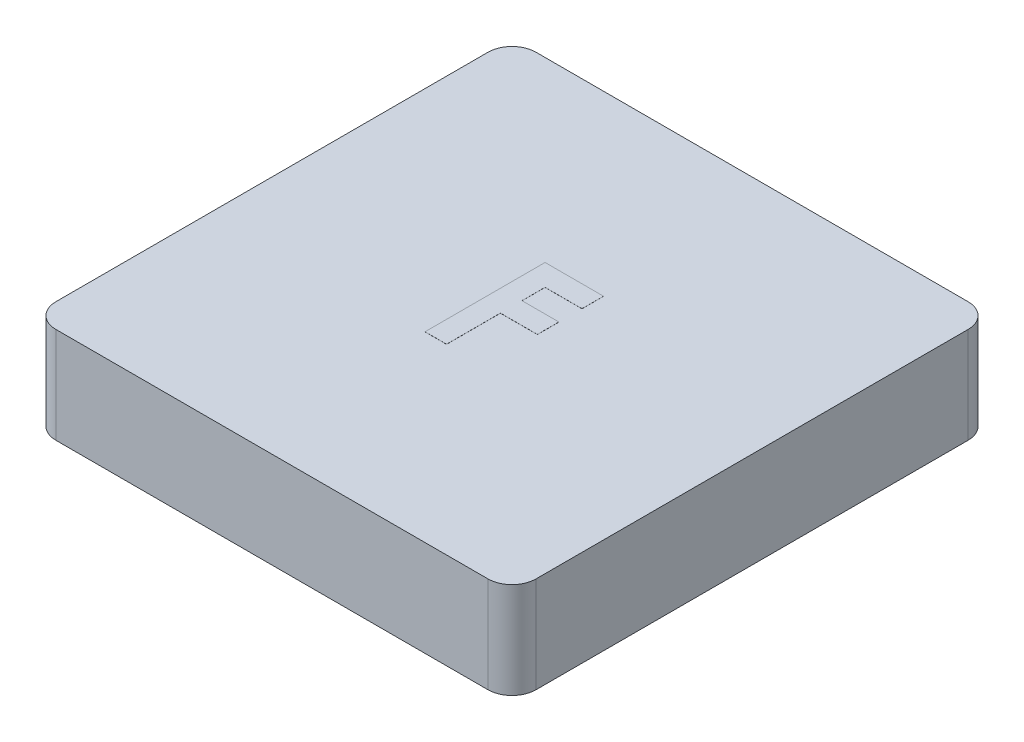
ISO-10303-21;
HEADER;
FILE_DESCRIPTION(('STEP AP214'),'2;1');
FILE_NAME('part.step','',(''),(''),'','','');
FILE_SCHEMA(('AUTOMOTIVE_DESIGN { 1 0 10303 214 1 1 1 1 }'));
ENDSEC;
DATA;
#1=APPLICATION_CONTEXT('core data for automotive mechanical design processes');
#2=APPLICATION_PROTOCOL_DEFINITION('international standard','automotive_design',2000,#1);
#3=PRODUCT_CONTEXT('',#1,'mechanical');
#4=PRODUCT('Part','Part','',(#3));
#5=PRODUCT_RELATED_PRODUCT_CATEGORY('part','',(#4));
#6=PRODUCT_DEFINITION_FORMATION('','',#4);
#7=PRODUCT_DEFINITION_CONTEXT('part definition',#1,'design');
#8=PRODUCT_DEFINITION('design','',#6,#7);
#9=PRODUCT_DEFINITION_SHAPE('','',#8);
#10=(LENGTH_UNIT() NAMED_UNIT(*) SI_UNIT(.MILLI.,.METRE.));
#11=(NAMED_UNIT(*) PLANE_ANGLE_UNIT() SI_UNIT($,.RADIAN.));
#12=(NAMED_UNIT(*) SI_UNIT($,.STERADIAN.) SOLID_ANGLE_UNIT());
#13=UNCERTAINTY_MEASURE_WITH_UNIT(LENGTH_MEASURE(1.E-05),#10,'distance_accuracy_value','');
#14=(GEOMETRIC_REPRESENTATION_CONTEXT(3) GLOBAL_UNCERTAINTY_ASSIGNED_CONTEXT((#13)) GLOBAL_UNIT_ASSIGNED_CONTEXT((#10,
#11,#12)) REPRESENTATION_CONTEXT('',''));
#15=CARTESIAN_POINT('',(0.,0.,0.));
#16=DIRECTION('',(0.,0.,1.));
#17=DIRECTION('',(1.,0.,0.));
#18=AXIS2_PLACEMENT_3D('',#15,#16,#17);
#19=CARTESIAN_POINT('',(0.,2.54,-12.7));
#20=DIRECTION('',(1.,0.,0.));
#21=DIRECTION('',(0.,0.,-1.));
#22=AXIS2_PLACEMENT_3D('',#19,#20,#21);
#23=PLANE('',#22);
#24=DIRECTION('',(0.,0.,1.));
#25=VECTOR('',#24,1.);
#26=CARTESIAN_POINT('',(0.,2.54,-12.7));
#27=LINE('',#26,#25);
#28=CARTESIAN_POINT('',(0.,2.54,-12.065));
#29=VERTEX_POINT('',#28);
#30=CARTESIAN_POINT('',(0.,2.54,-0.635));
#31=VERTEX_POINT('',#30);
#32=EDGE_CURVE('E308',#29,#31,#27,.T.);
#33=ORIENTED_EDGE('',*,*,#32,.F.);
#34=DIRECTION('',(0.,-1.,0.));
#35=VECTOR('',#34,1.);
#36=CARTESIAN_POINT('',(0.,2.54,-12.065));
#37=LINE('',#36,#35);
#38=CARTESIAN_POINT('',(0.,0.,-12.065));
#39=VERTEX_POINT('',#38);
#40=EDGE_CURVE('E333',#29,#39,#37,.T.);
#41=ORIENTED_EDGE('',*,*,#40,.T.);
#42=DIRECTION('',(0.,0.,1.));
#43=VECTOR('',#42,1.);
#44=CARTESIAN_POINT('',(0.,0.,-12.7));
#45=LINE('',#44,#43);
#46=CARTESIAN_POINT('',(0.,0.,-0.635));
#47=VERTEX_POINT('',#46);
#48=EDGE_CURVE('E288',#39,#47,#45,.T.);
#49=ORIENTED_EDGE('',*,*,#48,.T.);
#50=DIRECTION('',(0.,-1.,0.));
#51=VECTOR('',#50,1.);
#52=CARTESIAN_POINT('',(0.,2.54,-0.635));
#53=LINE('',#52,#51);
#54=EDGE_CURVE('E321',#47,#31,#53,.F.);
#55=ORIENTED_EDGE('',*,*,#54,.T.);
#56=EDGE_LOOP('',(#33,#41,#49,#55));
#57=FACE_BOUND('',#56,.T.);
#58=ADVANCED_FACE('F33',(#57),#23,.F.);
#59=CARTESIAN_POINT('',(0.,2.54,0.));
#60=DIRECTION('',(0.,0.,-1.));
#61=DIRECTION('',(-1.,0.,0.));
#62=AXIS2_PLACEMENT_3D('',#59,#60,#61);
#63=PLANE('',#62);
#64=DIRECTION('',(1.,0.,0.));
#65=VECTOR('',#64,1.);
#66=CARTESIAN_POINT('',(0.,0.,0.));
#67=LINE('',#66,#65);
#68=CARTESIAN_POINT('',(0.635,0.,0.));
#69=VERTEX_POINT('',#68);
#70=CARTESIAN_POINT('',(12.065,0.,0.));
#71=VERTEX_POINT('',#70);
#72=EDGE_CURVE('E324',#69,#71,#67,.T.);
#73=ORIENTED_EDGE('',*,*,#72,.T.);
#74=DIRECTION('',(0.,-1.,0.));
#75=VECTOR('',#74,1.);
#76=CARTESIAN_POINT('',(12.065,2.54,0.));
#77=LINE('',#76,#75);
#78=CARTESIAN_POINT('',(12.065,2.54,0.));
#79=VERTEX_POINT('',#78);
#80=EDGE_CURVE('E41',#71,#79,#77,.F.);
#81=ORIENTED_EDGE('',*,*,#80,.T.);
#82=DIRECTION('',(1.,0.,0.));
#83=VECTOR('',#82,1.);
#84=CARTESIAN_POINT('',(0.,2.54,0.));
#85=LINE('',#84,#83);
#86=CARTESIAN_POINT('',(0.635,2.54,0.));
#87=VERTEX_POINT('',#86);
#88=EDGE_CURVE('E311',#87,#79,#85,.T.);
#89=ORIENTED_EDGE('',*,*,#88,.F.);
#90=DIRECTION('',(0.,-1.,0.));
#91=VECTOR('',#90,1.);
#92=CARTESIAN_POINT('',(0.635,2.54,0.));
#93=LINE('',#92,#91);
#94=EDGE_CURVE('E362',#87,#69,#93,.T.);
#95=ORIENTED_EDGE('',*,*,#94,.T.);
#96=EDGE_LOOP('',(#73,#81,#89,#95));
#97=FACE_BOUND('',#96,.T.);
#98=ADVANCED_FACE('F367',(#97),#63,.F.);
#99=CARTESIAN_POINT('',(12.7,2.54,0.));
#100=DIRECTION('',(-1.,0.,0.));
#101=DIRECTION('',(0.,0.,1.));
#102=AXIS2_PLACEMENT_3D('',#99,#100,#101);
#103=PLANE('',#102);
#104=DIRECTION('',(0.,0.,-1.));
#105=VECTOR('',#104,1.);
#106=CARTESIAN_POINT('',(12.7,0.,0.));
#107=LINE('',#106,#105);
#108=CARTESIAN_POINT('',(12.7,0.,-0.635));
#109=VERTEX_POINT('',#108);
#110=CARTESIAN_POINT('',(12.7,0.,-12.065));
#111=VERTEX_POINT('',#110);
#112=EDGE_CURVE('E327',#109,#111,#107,.T.);
#113=ORIENTED_EDGE('',*,*,#112,.T.);
#114=DIRECTION('',(0.,-1.,0.));
#115=VECTOR('',#114,1.);
#116=CARTESIAN_POINT('',(12.7,2.54,-12.065));
#117=LINE('',#116,#115);
#118=CARTESIAN_POINT('',(12.7,2.54,-12.065));
#119=VERTEX_POINT('',#118);
#120=EDGE_CURVE('E360',#111,#119,#117,.F.);
#121=ORIENTED_EDGE('',*,*,#120,.T.);
#122=DIRECTION('',(0.,0.,-1.));
#123=VECTOR('',#122,1.);
#124=CARTESIAN_POINT('',(12.7,2.54,0.));
#125=LINE('',#124,#123);
#126=CARTESIAN_POINT('',(12.7,2.54,-0.635));
#127=VERTEX_POINT('',#126);
#128=EDGE_CURVE('E315',#127,#119,#125,.T.);
#129=ORIENTED_EDGE('',*,*,#128,.F.);
#130=DIRECTION('',(0.,-1.,0.));
#131=VECTOR('',#130,1.);
#132=CARTESIAN_POINT('',(12.7,2.54,-0.635));
#133=LINE('',#132,#131);
#134=EDGE_CURVE('E357',#127,#109,#133,.T.);
#135=ORIENTED_EDGE('',*,*,#134,.T.);
#136=EDGE_LOOP('',(#113,#121,#129,#135));
#137=FACE_BOUND('',#136,.T.);
#138=ADVANCED_FACE('F380',(#137),#103,.F.);
#139=CARTESIAN_POINT('',(12.7,2.54,-12.7));
#140=DIRECTION('',(0.,0.,1.));
#141=DIRECTION('',(1.,0.,0.));
#142=AXIS2_PLACEMENT_3D('',#139,#140,#141);
#143=PLANE('',#142);
#144=DIRECTION('',(-1.,0.,0.));
#145=VECTOR('',#144,1.);
#146=CARTESIAN_POINT('',(12.7,0.,-12.7));
#147=LINE('',#146,#145);
#148=CARTESIAN_POINT('',(12.065,0.,-12.7));
#149=VERTEX_POINT('',#148);
#150=CARTESIAN_POINT('',(0.634999999999995,0.,-12.7));
#151=VERTEX_POINT('',#150);
#152=EDGE_CURVE('E312',#149,#151,#147,.T.);
#153=ORIENTED_EDGE('',*,*,#152,.T.);
#154=DIRECTION('',(0.,-1.,0.));
#155=VECTOR('',#154,1.);
#156=CARTESIAN_POINT('',(0.634999999999995,2.54,-12.7));
#157=LINE('',#156,#155);
#158=CARTESIAN_POINT('',(0.634999999999995,2.54,-12.7));
#159=VERTEX_POINT('',#158);
#160=EDGE_CURVE('E347',#151,#159,#157,.F.);
#161=ORIENTED_EDGE('',*,*,#160,.T.);
#162=DIRECTION('',(-1.,0.,0.));
#163=VECTOR('',#162,1.);
#164=CARTESIAN_POINT('',(12.7,2.54,-12.7));
#165=LINE('',#164,#163);
#166=CARTESIAN_POINT('',(12.065,2.54,-12.7));
#167=VERTEX_POINT('',#166);
#168=EDGE_CURVE('E318',#167,#159,#165,.T.);
#169=ORIENTED_EDGE('',*,*,#168,.F.);
#170=DIRECTION('',(0.,-1.,0.));
#171=VECTOR('',#170,1.);
#172=CARTESIAN_POINT('',(12.065,2.54,-12.7));
#173=LINE('',#172,#171);
#174=EDGE_CURVE('E344',#167,#149,#173,.T.);
#175=ORIENTED_EDGE('',*,*,#174,.T.);
#176=EDGE_LOOP('',(#153,#161,#169,#175));
#177=FACE_BOUND('',#176,.T.);
#178=ADVANCED_FACE('F392',(#177),#143,.F.);
#179=CARTESIAN_POINT('',(0.,2.54,0.));
#180=DIRECTION('',(0.,1.,0.));
#181=DIRECTION('',(0.,0.,1.));
#182=AXIS2_PLACEMENT_3D('',#179,#180,#181);
#183=PLANE('',#182);
#184=DIRECTION('',(0.,0.,-1.));
#185=VECTOR('',#184,1.);
#186=CARTESIAN_POINT('',(5.57334615384615,2.54,-4.826));
#187=LINE('',#186,#185);
#188=CARTESIAN_POINT('',(5.57334615384615,2.54,-4.826));
#189=VERTEX_POINT('',#188);
#190=CARTESIAN_POINT('',(5.57334615384615,2.54,-8.001));
#191=VERTEX_POINT('',#190);
#192=EDGE_CURVE('E230',#189,#191,#187,.T.);
#193=ORIENTED_EDGE('',*,*,#192,.T.);
#194=DIRECTION('',(1.,0.,0.));
#195=VECTOR('',#194,1.);
#196=CARTESIAN_POINT('',(5.57334615384615,2.54,-8.001));
#197=LINE('',#196,#195);
#198=CARTESIAN_POINT('',(7.12014102564102,2.54,-8.001));
#199=VERTEX_POINT('',#198);
#200=EDGE_CURVE('E187',#191,#199,#197,.T.);
#201=ORIENTED_EDGE('',*,*,#200,.T.);
#202=DIRECTION('',(0.,0.,1.));
#203=VECTOR('',#202,1.);
#204=CARTESIAN_POINT('',(7.12014102564102,2.54,-8.001));
#205=LINE('',#204,#203);
#206=CARTESIAN_POINT('',(7.12014102564102,2.54,-7.4311282051282));
#207=VERTEX_POINT('',#206);
#208=EDGE_CURVE('E233',#199,#207,#205,.T.);
#209=ORIENTED_EDGE('',*,*,#208,.T.);
#210=DIRECTION('',(-1.,0.,0.));
#211=VECTOR('',#210,1.);
#212=CARTESIAN_POINT('',(7.12014102564102,2.54,-7.4311282051282));
#213=LINE('',#212,#211);
#214=CARTESIAN_POINT('',(6.14321794871794,2.54,-7.4311282051282));
#215=VERTEX_POINT('',#214);
#216=EDGE_CURVE('E235',#207,#215,#213,.T.);
#217=ORIENTED_EDGE('',*,*,#216,.T.);
#218=DIRECTION('',(0.,0.,1.));
#219=VECTOR('',#218,1.);
#220=CARTESIAN_POINT('',(6.14321794871794,2.54,-7.4311282051282));
#221=LINE('',#220,#219);
#222=CARTESIAN_POINT('',(6.14321794871794,2.54,-6.82055128205128));
#223=VERTEX_POINT('',#222);
#224=EDGE_CURVE('E237',#215,#223,#221,.T.);
#225=ORIENTED_EDGE('',*,*,#224,.T.);
#226=DIRECTION('',(1.,0.,0.));
#227=VECTOR('',#226,1.);
#228=CARTESIAN_POINT('',(6.14321794871794,2.54,-6.82055128205128));
#229=LINE('',#228,#227);
#230=CARTESIAN_POINT('',(7.12014102564102,2.54,-6.82055128205128));
#231=VERTEX_POINT('',#230);
#232=EDGE_CURVE('E239',#223,#231,#229,.T.);
#233=ORIENTED_EDGE('',*,*,#232,.T.);
#234=DIRECTION('',(0.,0.,1.));
#235=VECTOR('',#234,1.);
#236=CARTESIAN_POINT('',(7.12014102564102,2.54,-6.82055128205128));
#237=LINE('',#236,#235);
#238=CARTESIAN_POINT('',(7.12014102564102,2.54,-6.25067948717949));
#239=VERTEX_POINT('',#238);
#240=EDGE_CURVE('E241',#231,#239,#237,.T.);
#241=ORIENTED_EDGE('',*,*,#240,.T.);
#242=DIRECTION('',(-1.,0.,0.));
#243=VECTOR('',#242,1.);
#244=CARTESIAN_POINT('',(7.12014102564102,2.54,-6.25067948717949));
#245=LINE('',#244,#243);
#246=CARTESIAN_POINT('',(6.14321794871794,2.54,-6.25067948717949));
#247=VERTEX_POINT('',#246);
#248=EDGE_CURVE('E243',#239,#247,#245,.T.);
#249=ORIENTED_EDGE('',*,*,#248,.T.);
#250=DIRECTION('',(0.,0.,1.));
#251=VECTOR('',#250,1.);
#252=CARTESIAN_POINT('',(6.14321794871794,2.54,-6.25067948717949));
#253=LINE('',#252,#251);
#254=CARTESIAN_POINT('',(6.14321794871794,2.54,-4.826));
#255=VERTEX_POINT('',#254);
#256=EDGE_CURVE('E53',#247,#255,#253,.T.);
#257=ORIENTED_EDGE('',*,*,#256,.T.);
#258=DIRECTION('',(-1.,0.,0.));
#259=VECTOR('',#258,1.);
#260=CARTESIAN_POINT('',(6.14321794871794,2.54,-4.826));
#261=LINE('',#260,#259);
#262=EDGE_CURVE('E48',#255,#189,#261,.T.);
#263=ORIENTED_EDGE('',*,*,#262,.T.);
#264=EDGE_LOOP('',(#193,#201,#209,#217,#225,#233,#241,#249,#257,#263));
#265=FACE_BOUND('',#264,.T.);
#266=ORIENTED_EDGE('',*,*,#168,.T.);
#267=CARTESIAN_POINT('',(0.634999999999995,2.54,-12.065));
#268=DIRECTION('',(0.,1.,0.));
#269=DIRECTION('',(0.,0.,1.));
#270=AXIS2_PLACEMENT_3D('',#267,#268,#269);
#271=CIRCLE('',#270,0.635);
#272=EDGE_CURVE('E355',#159,#29,#271,.T.);
#273=ORIENTED_EDGE('',*,*,#272,.T.);
#274=ORIENTED_EDGE('',*,*,#32,.T.);
#275=CARTESIAN_POINT('',(0.635,2.54,-0.635));
#276=DIRECTION('',(0.,1.,0.));
#277=DIRECTION('',(0.,0.,1.));
#278=AXIS2_PLACEMENT_3D('',#275,#276,#277);
#279=CIRCLE('',#278,0.635);
#280=EDGE_CURVE('E349',#31,#87,#279,.T.);
#281=ORIENTED_EDGE('',*,*,#280,.T.);
#282=ORIENTED_EDGE('',*,*,#88,.T.);
#283=CARTESIAN_POINT('',(12.065,2.54,-0.635));
#284=DIRECTION('',(0.,1.,0.));
#285=DIRECTION('',(0.,0.,1.));
#286=AXIS2_PLACEMENT_3D('',#283,#284,#285);
#287=CIRCLE('',#286,0.635);
#288=EDGE_CURVE('E351',#79,#127,#287,.T.);
#289=ORIENTED_EDGE('',*,*,#288,.T.);
#290=ORIENTED_EDGE('',*,*,#128,.T.);
#291=CARTESIAN_POINT('',(12.065,2.54,-12.065));
#292=DIRECTION('',(0.,1.,0.));
#293=DIRECTION('',(0.,0.,1.));
#294=AXIS2_PLACEMENT_3D('',#291,#292,#293);
#295=CIRCLE('',#294,0.635);
#296=EDGE_CURVE('E353',#119,#167,#295,.T.);
#297=ORIENTED_EDGE('',*,*,#296,.T.);
#298=EDGE_LOOP('',(#266,#273,#274,#281,#282,#289,#290,#297));
#299=FACE_BOUND('',#298,.T.);
#300=ADVANCED_FACE('F373',(#265,#299),#183,.T.);
#301=CARTESIAN_POINT('',(0.,0.,0.));
#302=DIRECTION('',(0.,1.,0.));
#303=DIRECTION('',(0.,0.,1.));
#304=AXIS2_PLACEMENT_3D('',#301,#302,#303);
#305=PLANE('',#304);
#306=DIRECTION('',(-1.,0.,0.));
#307=VECTOR('',#306,1.);
#308=CARTESIAN_POINT('',(12.7,0.,-12.065));
#309=LINE('',#308,#307);
#310=CARTESIAN_POINT('',(12.065,0.,-12.065));
#311=VERTEX_POINT('',#310);
#312=CARTESIAN_POINT('',(0.634999999999995,0.,-12.065));
#313=VERTEX_POINT('',#312);
#314=EDGE_CURVE('E276',#311,#313,#309,.T.);
#315=ORIENTED_EDGE('',*,*,#314,.T.);
#316=DIRECTION('',(0.,0.,1.));
#317=VECTOR('',#316,1.);
#318=CARTESIAN_POINT('',(0.634999999999995,0.,-12.7));
#319=LINE('',#318,#317);
#320=CARTESIAN_POINT('',(0.635,0.,-0.635));
#321=VERTEX_POINT('',#320);
#322=EDGE_CURVE('E271',#313,#321,#319,.T.);
#323=ORIENTED_EDGE('',*,*,#322,.T.);
#324=DIRECTION('',(1.,0.,0.));
#325=VECTOR('',#324,1.);
#326=CARTESIAN_POINT('',(0.,0.,-0.635));
#327=LINE('',#326,#325);
#328=CARTESIAN_POINT('',(12.065,0.,-0.635));
#329=VERTEX_POINT('',#328);
#330=EDGE_CURVE('E300',#321,#329,#327,.T.);
#331=ORIENTED_EDGE('',*,*,#330,.T.);
#332=DIRECTION('',(0.,0.,-1.));
#333=VECTOR('',#332,1.);
#334=CARTESIAN_POINT('',(12.065,0.,0.));
#335=LINE('',#334,#333);
#336=EDGE_CURVE('E303',#329,#311,#335,.T.);
#337=ORIENTED_EDGE('',*,*,#336,.T.);
#338=EDGE_LOOP('',(#315,#323,#331,#337));
#339=FACE_BOUND('',#338,.T.);
#340=ORIENTED_EDGE('',*,*,#48,.F.);
#341=CARTESIAN_POINT('',(0.634999999999995,0.,-12.065));
#342=DIRECTION('',(0.,1.,0.));
#343=DIRECTION('',(0.,0.,1.));
#344=AXIS2_PLACEMENT_3D('',#341,#342,#343);
#345=CIRCLE('',#344,0.635);
#346=EDGE_CURVE('E342',#39,#151,#345,.F.);
#347=ORIENTED_EDGE('',*,*,#346,.T.);
#348=ORIENTED_EDGE('',*,*,#152,.F.);
#349=CARTESIAN_POINT('',(12.065,0.,-12.065));
#350=DIRECTION('',(0.,1.,0.));
#351=DIRECTION('',(0.,0.,1.));
#352=AXIS2_PLACEMENT_3D('',#349,#350,#351);
#353=CIRCLE('',#352,0.635);
#354=EDGE_CURVE('E340',#149,#111,#353,.F.);
#355=ORIENTED_EDGE('',*,*,#354,.T.);
#356=ORIENTED_EDGE('',*,*,#112,.F.);
#357=CARTESIAN_POINT('',(12.065,0.,-0.635));
#358=DIRECTION('',(0.,1.,0.));
#359=DIRECTION('',(0.,0.,1.));
#360=AXIS2_PLACEMENT_3D('',#357,#358,#359);
#361=CIRCLE('',#360,0.635);
#362=EDGE_CURVE('E338',#109,#71,#361,.F.);
#363=ORIENTED_EDGE('',*,*,#362,.T.);
#364=ORIENTED_EDGE('',*,*,#72,.F.);
#365=CARTESIAN_POINT('',(0.635,0.,-0.635));
#366=DIRECTION('',(0.,1.,0.));
#367=DIRECTION('',(0.,0.,1.));
#368=AXIS2_PLACEMENT_3D('',#365,#366,#367);
#369=CIRCLE('',#368,0.635);
#370=EDGE_CURVE('E336',#69,#47,#369,.F.);
#371=ORIENTED_EDGE('',*,*,#370,.T.);
#372=EDGE_LOOP('',(#340,#347,#348,#355,#356,#363,#364,#371));
#373=FACE_BOUND('',#372,.T.);
#374=ADVANCED_FACE('F384',(#339,#373),#305,.F.);
#375=CARTESIAN_POINT('',(0.634999999999995,2.54,-12.065));
#376=DIRECTION('',(0.,-1.,0.));
#377=DIRECTION('',(0.,0.,-1.));
#378=AXIS2_PLACEMENT_3D('',#375,#376,#377);
#379=CYLINDRICAL_SURFACE('',#378,0.635);
#380=ORIENTED_EDGE('',*,*,#272,.F.);
#381=ORIENTED_EDGE('',*,*,#160,.F.);
#382=ORIENTED_EDGE('',*,*,#346,.F.);
#383=ORIENTED_EDGE('',*,*,#40,.F.);
#384=EDGE_LOOP('',(#380,#381,#382,#383));
#385=FACE_BOUND('',#384,.T.);
#386=ADVANCED_FACE('F398',(#385),#379,.T.);
#387=CARTESIAN_POINT('',(12.065,2.54,-12.065));
#388=DIRECTION('',(0.,-1.,0.));
#389=DIRECTION('',(0.,0.,-1.));
#390=AXIS2_PLACEMENT_3D('',#387,#388,#389);
#391=CYLINDRICAL_SURFACE('',#390,0.635);
#392=ORIENTED_EDGE('',*,*,#296,.F.);
#393=ORIENTED_EDGE('',*,*,#120,.F.);
#394=ORIENTED_EDGE('',*,*,#354,.F.);
#395=ORIENTED_EDGE('',*,*,#174,.F.);
#396=EDGE_LOOP('',(#392,#393,#394,#395));
#397=FACE_BOUND('',#396,.T.);
#398=ADVANCED_FACE('F389',(#397),#391,.T.);
#399=CARTESIAN_POINT('',(12.065,2.54,-0.635));
#400=DIRECTION('',(0.,-1.,0.));
#401=DIRECTION('',(0.,0.,-1.));
#402=AXIS2_PLACEMENT_3D('',#399,#400,#401);
#403=CYLINDRICAL_SURFACE('',#402,0.635);
#404=ORIENTED_EDGE('',*,*,#288,.F.);
#405=ORIENTED_EDGE('',*,*,#80,.F.);
#406=ORIENTED_EDGE('',*,*,#362,.F.);
#407=ORIENTED_EDGE('',*,*,#134,.F.);
#408=EDGE_LOOP('',(#404,#405,#406,#407));
#409=FACE_BOUND('',#408,.T.);
#410=ADVANCED_FACE('F377',(#409),#403,.T.);
#411=CARTESIAN_POINT('',(0.635,2.54,-0.635));
#412=DIRECTION('',(0.,-1.,0.));
#413=DIRECTION('',(0.,0.,-1.));
#414=AXIS2_PLACEMENT_3D('',#411,#412,#413);
#415=CYLINDRICAL_SURFACE('',#414,0.635);
#416=ORIENTED_EDGE('',*,*,#280,.F.);
#417=ORIENTED_EDGE('',*,*,#54,.F.);
#418=ORIENTED_EDGE('',*,*,#370,.F.);
#419=ORIENTED_EDGE('',*,*,#94,.F.);
#420=EDGE_LOOP('',(#416,#417,#418,#419));
#421=FACE_BOUND('',#420,.T.);
#422=ADVANCED_FACE('F35',(#421),#415,.T.);
#423=CARTESIAN_POINT('',(0.634999999999995,2.54,-12.7));
#424=DIRECTION('',(1.,0.,0.));
#425=DIRECTION('',(0.,0.,-1.));
#426=AXIS2_PLACEMENT_3D('',#423,#424,#425);
#427=PLANE('',#426);
#428=DIRECTION('',(0.,0.,1.));
#429=VECTOR('',#428,1.);
#430=CARTESIAN_POINT('',(0.634999999999995,1.905,-12.7));
#431=LINE('',#430,#429);
#432=CARTESIAN_POINT('',(0.634999999999995,1.905,-12.065));
#433=VERTEX_POINT('',#432);
#434=CARTESIAN_POINT('',(0.635,1.905,-0.635));
#435=VERTEX_POINT('',#434);
#436=EDGE_CURVE('E272',#433,#435,#431,.T.);
#437=ORIENTED_EDGE('',*,*,#436,.T.);
#438=DIRECTION('',(0.,1.,0.));
#439=VECTOR('',#438,1.);
#440=CARTESIAN_POINT('',(0.635,2.54,-0.635));
#441=LINE('',#440,#439);
#442=EDGE_CURVE('E281',#321,#435,#441,.T.);
#443=ORIENTED_EDGE('',*,*,#442,.F.);
#444=ORIENTED_EDGE('',*,*,#322,.F.);
#445=DIRECTION('',(0.,1.,0.));
#446=VECTOR('',#445,1.);
#447=CARTESIAN_POINT('',(0.634999999999995,2.54,-12.065));
#448=LINE('',#447,#446);
#449=EDGE_CURVE('E277',#313,#433,#448,.T.);
#450=ORIENTED_EDGE('',*,*,#449,.T.);
#451=EDGE_LOOP('',(#437,#443,#444,#450));
#452=FACE_BOUND('',#451,.T.);
#453=ADVANCED_FACE('F403',(#452),#427,.T.);
#454=CARTESIAN_POINT('',(0.,2.54,-0.635));
#455=DIRECTION('',(0.,0.,-1.));
#456=DIRECTION('',(-1.,0.,0.));
#457=AXIS2_PLACEMENT_3D('',#454,#455,#456);
#458=PLANE('',#457);
#459=ORIENTED_EDGE('',*,*,#330,.F.);
#460=ORIENTED_EDGE('',*,*,#442,.T.);
#461=DIRECTION('',(1.,0.,0.));
#462=VECTOR('',#461,1.);
#463=CARTESIAN_POINT('',(0.,1.905,-0.635));
#464=LINE('',#463,#462);
#465=CARTESIAN_POINT('',(12.065,1.905,-0.635));
#466=VERTEX_POINT('',#465);
#467=EDGE_CURVE('E275',#435,#466,#464,.T.);
#468=ORIENTED_EDGE('',*,*,#467,.T.);
#469=DIRECTION('',(0.,1.,0.));
#470=VECTOR('',#469,1.);
#471=CARTESIAN_POINT('',(12.065,2.54,-0.635));
#472=LINE('',#471,#470);
#473=EDGE_CURVE('E285',#329,#466,#472,.T.);
#474=ORIENTED_EDGE('',*,*,#473,.F.);
#475=EDGE_LOOP('',(#459,#460,#468,#474));
#476=FACE_BOUND('',#475,.T.);
#477=ADVANCED_FACE('F408',(#476),#458,.T.);
#478=CARTESIAN_POINT('',(12.065,2.54,0.));
#479=DIRECTION('',(-1.,0.,0.));
#480=DIRECTION('',(0.,0.,1.));
#481=AXIS2_PLACEMENT_3D('',#478,#479,#480);
#482=PLANE('',#481);
#483=ORIENTED_EDGE('',*,*,#336,.F.);
#484=ORIENTED_EDGE('',*,*,#473,.T.);
#485=DIRECTION('',(0.,0.,-1.));
#486=VECTOR('',#485,1.);
#487=CARTESIAN_POINT('',(12.065,1.905,0.));
#488=LINE('',#487,#486);
#489=CARTESIAN_POINT('',(12.065,1.905,-12.065));
#490=VERTEX_POINT('',#489);
#491=EDGE_CURVE('E291',#466,#490,#488,.T.);
#492=ORIENTED_EDGE('',*,*,#491,.T.);
#493=DIRECTION('',(0.,1.,0.));
#494=VECTOR('',#493,1.);
#495=CARTESIAN_POINT('',(12.065,2.54,-12.065));
#496=LINE('',#495,#494);
#497=EDGE_CURVE('E280',#311,#490,#496,.T.);
#498=ORIENTED_EDGE('',*,*,#497,.F.);
#499=EDGE_LOOP('',(#483,#484,#492,#498));
#500=FACE_BOUND('',#499,.T.);
#501=ADVANCED_FACE('F461',(#500),#482,.T.);
#502=CARTESIAN_POINT('',(12.7,2.54,-12.065));
#503=DIRECTION('',(0.,0.,1.));
#504=DIRECTION('',(1.,0.,0.));
#505=AXIS2_PLACEMENT_3D('',#502,#503,#504);
#506=PLANE('',#505);
#507=ORIENTED_EDGE('',*,*,#314,.F.);
#508=ORIENTED_EDGE('',*,*,#497,.T.);
#509=DIRECTION('',(-1.,0.,0.));
#510=VECTOR('',#509,1.);
#511=CARTESIAN_POINT('',(12.7,1.905,-12.065));
#512=LINE('',#511,#510);
#513=EDGE_CURVE('E284',#490,#433,#512,.T.);
#514=ORIENTED_EDGE('',*,*,#513,.T.);
#515=ORIENTED_EDGE('',*,*,#449,.F.);
#516=EDGE_LOOP('',(#507,#508,#514,#515));
#517=FACE_BOUND('',#516,.T.);
#518=ADVANCED_FACE('F471',(#517),#506,.T.);
#519=CARTESIAN_POINT('',(0.,1.905,0.));
#520=DIRECTION('',(0.,1.,0.));
#521=DIRECTION('',(0.,0.,1.));
#522=AXIS2_PLACEMENT_3D('',#519,#520,#521);
#523=PLANE('',#522);
#524=CARTESIAN_POINT('',(6.34999999999999,1.905,-6.35));
#525=DIRECTION('',(0.,1.,0.));
#526=DIRECTION('',(0.,0.,1.));
#527=AXIS2_PLACEMENT_3D('',#524,#525,#526);
#528=CIRCLE('',#527,2.54);
#529=CARTESIAN_POINT('',(6.34999999999999,1.905,-3.81));
#530=VERTEX_POINT('',#529);
#531=EDGE_CURVE('E11',#530,#530,#528,.F.);
#532=ORIENTED_EDGE('',*,*,#531,.F.);
#533=EDGE_LOOP('',(#532));
#534=FACE_BOUND('',#533,.T.);
#535=ORIENTED_EDGE('',*,*,#513,.F.);
#536=ORIENTED_EDGE('',*,*,#491,.F.);
#537=ORIENTED_EDGE('',*,*,#467,.F.);
#538=ORIENTED_EDGE('',*,*,#436,.F.);
#539=EDGE_LOOP('',(#535,#536,#537,#538));
#540=FACE_BOUND('',#539,.T.);
#541=ADVANCED_FACE('F481',(#534,#540),#523,.F.);
#542=CARTESIAN_POINT('',(6.34999999999999,-7.18420489685532,-6.35));
#543=DIRECTION('',(0.,1.,0.));
#544=DIRECTION('',(0.,0.,1.));
#545=AXIS2_PLACEMENT_3D('',#542,#543,#544);
#546=CYLINDRICAL_SURFACE('',#545,2.54);
#547=CARTESIAN_POINT('',(6.34999999999999,0.,-6.35));
#548=DIRECTION('',(0.,1.,0.));
#549=DIRECTION('',(0.,0.,1.));
#550=AXIS2_PLACEMENT_3D('',#547,#548,#549);
#551=CIRCLE('',#550,2.54);
#552=CARTESIAN_POINT('',(6.34999999999999,0.,-3.81));
#553=VERTEX_POINT('',#552);
#554=EDGE_CURVE('E247',#553,#553,#551,.T.);
#555=CARTESIAN_POINT('',(6.34999999999999,0.,-3.81));
#556=CARTESIAN_POINT('',(6.34999999999999,0.0198437499999991,-3.81));
#557=CARTESIAN_POINT('',(6.34999999999999,0.0396874999999989,-3.81));
#558=CARTESIAN_POINT('',(6.34999999999999,0.079374999999999,-3.81));
#559=CARTESIAN_POINT('',(6.34999999999999,0.0992187499999992,-3.81));
#560=CARTESIAN_POINT('',(6.34999999999999,0.138906249999999,-3.81));
#561=CARTESIAN_POINT('',(6.34999999999999,0.158749999999999,-3.81));
#562=CARTESIAN_POINT('',(6.34999999999999,0.198437499999999,-3.81));
#563=CARTESIAN_POINT('',(6.34999999999999,0.218281249999999,-3.81));
#564=CARTESIAN_POINT('',(6.34999999999999,0.25796875,-3.81));
#565=CARTESIAN_POINT('',(6.34999999999999,0.277812499999999,-3.81));
#566=CARTESIAN_POINT('',(6.34999999999999,0.317499999999999,-3.81));
#567=CARTESIAN_POINT('',(6.34999999999999,0.337343749999999,-3.81));
#568=CARTESIAN_POINT('',(6.34999999999999,0.377031249999999,-3.81));
#569=CARTESIAN_POINT('',(6.34999999999999,0.396874999999999,-3.81));
#570=CARTESIAN_POINT('',(6.34999999999999,0.436562499999999,-3.81));
#571=CARTESIAN_POINT('',(6.34999999999999,0.456406249999999,-3.81));
#572=CARTESIAN_POINT('',(6.34999999999999,0.496093749999999,-3.81));
#573=CARTESIAN_POINT('',(6.34999999999999,0.515937499999999,-3.81));
#574=CARTESIAN_POINT('',(6.34999999999999,0.555624999999999,-3.81));
#575=CARTESIAN_POINT('',(6.34999999999999,0.575468749999999,-3.81));
#576=CARTESIAN_POINT('',(6.34999999999999,0.615156249999999,-3.81));
#577=CARTESIAN_POINT('',(6.34999999999999,0.634999999999999,-3.81));
#578=CARTESIAN_POINT('',(6.34999999999999,0.674687499999998,-3.81));
#579=CARTESIAN_POINT('',(6.34999999999999,0.694531249999998,-3.81));
#580=CARTESIAN_POINT('',(6.34999999999999,0.734218749999998,-3.81));
#581=CARTESIAN_POINT('',(6.34999999999999,0.754062499999998,-3.81));
#582=CARTESIAN_POINT('',(6.34999999999999,0.793749999999998,-3.81));
#583=CARTESIAN_POINT('',(6.34999999999999,0.813593749999999,-3.81));
#584=CARTESIAN_POINT('',(6.34999999999999,0.853281249999999,-3.81));
#585=CARTESIAN_POINT('',(6.34999999999999,0.873124999999999,-3.81));
#586=CARTESIAN_POINT('',(6.34999999999999,0.912812499999999,-3.81));
#587=CARTESIAN_POINT('',(6.34999999999999,0.932656249999999,-3.81));
#588=CARTESIAN_POINT('',(6.34999999999999,0.972343749999998,-3.81));
#589=CARTESIAN_POINT('',(6.34999999999999,0.992187499999998,-3.81));
#590=CARTESIAN_POINT('',(6.34999999999999,1.031875,-3.81));
#591=CARTESIAN_POINT('',(6.34999999999999,1.05171875,-3.81));
#592=CARTESIAN_POINT('',(6.34999999999999,1.09140625,-3.81));
#593=CARTESIAN_POINT('',(6.34999999999999,1.11125,-3.81));
#594=CARTESIAN_POINT('',(6.34999999999999,1.1509375,-3.81));
#595=CARTESIAN_POINT('',(6.34999999999999,1.17078125,-3.81));
#596=CARTESIAN_POINT('',(6.34999999999999,1.21046875,-3.81));
#597=CARTESIAN_POINT('',(6.34999999999999,1.2303125,-3.81));
#598=CARTESIAN_POINT('',(6.34999999999999,1.27,-3.81));
#599=CARTESIAN_POINT('',(6.34999999999999,1.28984375,-3.81));
#600=CARTESIAN_POINT('',(6.34999999999999,1.32953125,-3.81));
#601=CARTESIAN_POINT('',(6.34999999999999,1.349375,-3.81));
#602=CARTESIAN_POINT('',(6.34999999999999,1.3890625,-3.81));
#603=CARTESIAN_POINT('',(6.34999999999999,1.40890625,-3.81));
#604=CARTESIAN_POINT('',(6.34999999999999,1.44859375,-3.81));
#605=CARTESIAN_POINT('',(6.34999999999999,1.4684375,-3.81));
#606=CARTESIAN_POINT('',(6.34999999999999,1.508125,-3.81));
#607=CARTESIAN_POINT('',(6.34999999999999,1.52796875,-3.81));
#608=CARTESIAN_POINT('',(6.34999999999999,1.56765625,-3.81));
#609=CARTESIAN_POINT('',(6.34999999999999,1.5875,-3.81));
#610=CARTESIAN_POINT('',(6.34999999999999,1.6271875,-3.81));
#611=CARTESIAN_POINT('',(6.34999999999999,1.64703125,-3.81));
#612=CARTESIAN_POINT('',(6.34999999999999,1.68671875,-3.81));
#613=CARTESIAN_POINT('',(6.34999999999999,1.7065625,-3.81));
#614=CARTESIAN_POINT('',(6.34999999999999,1.74625,-3.81));
#615=CARTESIAN_POINT('',(6.34999999999999,1.76609375,-3.81));
#616=CARTESIAN_POINT('',(6.34999999999999,1.80578125,-3.81));
#617=CARTESIAN_POINT('',(6.34999999999999,1.825625,-3.81));
#618=CARTESIAN_POINT('',(6.34999999999999,1.8653125,-3.81));
#619=CARTESIAN_POINT('',(6.34999999999999,1.88515625,-3.81));
#620=CARTESIAN_POINT('',(6.34999999999999,1.905,-3.81));
#621=B_SPLINE_CURVE_WITH_KNOTS('',3,(#555,#556,#557,#558,#559,#560,#561,#562,#563,#564,#565,
#566,#567,#568,#569,#570,#571,#572,#573,#574,#575,#576,#577,#578,#579,#580,#581,#582,#583,#584,
#585,#586,#587,#588,#589,#590,#591,#592,#593,#594,#595,#596,#597,#598,#599,#600,#601,#602,#603,
#604,#605,#606,#607,#608,#609,#610,#611,#612,#613,#614,#615,#616,#617,#618,#619,#620),
.UNSPECIFIED.,.F.,.F.,(4,2,2,2,2,2,2,2,2,2,2,2,2,2,2,2,2,2,2,2,2,2,2,2,2,2,2,2,2,2,2,2,4),(0.,
0.0595312499999997,0.1190625,0.17859375,0.238125,0.29765625,0.3571875,0.41671875,0.47625,
0.53578125,0.5953125,0.654843749999999,0.714374999999999,0.773906249999999,0.8334375,0.89296875,
0.952499999999999,1.01203125,1.0715625,1.13109375,1.190625,1.25015625,1.3096875,1.36921875,
1.42875,1.48828125,1.5478125,1.60734375,1.666875,1.72640625,1.7859375,1.84546875,1.905),.UNSPECIFIED.);
#622=EDGE_CURVE('BSEAM491',#553,#530,#621,.T.);
#623=ORIENTED_EDGE('',*,*,#554,.T.);
#624=ORIENTED_EDGE('',*,*,#531,.T.);
#625=ORIENTED_EDGE('',*,*,#622,.T.);
#626=ORIENTED_EDGE('',*,*,#622,.F.);
#627=EDGE_LOOP('',(#623,#625,#624,#626));
#628=FACE_BOUND('',#627,.T.);
#629=ADVANCED_FACE('F491',(#628),#546,.T.);
#630=CARTESIAN_POINT('',(0.,0.,0.));
#631=DIRECTION('',(0.,1.,0.));
#632=DIRECTION('',(0.,0.,1.));
#633=AXIS2_PLACEMENT_3D('',#630,#631,#632);
#634=PLANE('',#633);
#635=ORIENTED_EDGE('',*,*,#554,.F.);
#636=EDGE_LOOP('',(#635));
#637=FACE_BOUND('',#636,.T.);
#638=ADVANCED_FACE('F501',(#637),#634,.F.);
#639=CARTESIAN_POINT('',(5.57334615384615,2.54254,-4.826));
#640=DIRECTION('',(-1.,0.,0.));
#641=DIRECTION('',(0.,0.,1.));
#642=AXIS2_PLACEMENT_3D('',#639,#640,#641);
#643=PLANE('',#642);
#644=ORIENTED_EDGE('',*,*,#192,.F.);
#645=DIRECTION('',(0.,-1.,0.));
#646=VECTOR('',#645,1.);
#647=CARTESIAN_POINT('',(5.57334615384615,2.54254,-4.826));
#648=LINE('',#647,#646);
#649=CARTESIAN_POINT('',(5.57334615384615,2.54254,-4.826));
#650=VERTEX_POINT('',#649);
#651=EDGE_CURVE('E206',#650,#189,#648,.T.);
#652=ORIENTED_EDGE('',*,*,#651,.F.);
#653=DIRECTION('',(0.,0.,-1.));
#654=VECTOR('',#653,1.);
#655=CARTESIAN_POINT('',(5.57334615384615,2.54254,-4.826));
#656=LINE('',#655,#654);
#657=CARTESIAN_POINT('',(5.57334615384615,2.54254,-8.001));
#658=VERTEX_POINT('',#657);
#659=EDGE_CURVE('E199',#650,#658,#656,.T.);
#660=ORIENTED_EDGE('',*,*,#659,.T.);
#661=DIRECTION('',(0.,-1.,0.));
#662=VECTOR('',#661,1.);
#663=CARTESIAN_POINT('',(5.57334615384615,2.54254,-8.001));
#664=LINE('',#663,#662);
#665=EDGE_CURVE('E182',#658,#191,#664,.T.);
#666=ORIENTED_EDGE('',*,*,#665,.T.);
#667=EDGE_LOOP('',(#644,#652,#660,#666));
#668=FACE_BOUND('',#667,.T.);
#669=ADVANCED_FACE('F205',(#668),#643,.T.);
#670=CARTESIAN_POINT('',(6.14321794871794,2.54254,-4.826));
#671=DIRECTION('',(0.,0.,1.));
#672=DIRECTION('',(1.,0.,0.));
#673=AXIS2_PLACEMENT_3D('',#670,#671,#672);
#674=PLANE('',#673);
#675=ORIENTED_EDGE('',*,*,#262,.F.);
#676=DIRECTION('',(0.,-1.,0.));
#677=VECTOR('',#676,1.);
#678=CARTESIAN_POINT('',(6.14321794871794,2.54254,-4.826));
#679=LINE('',#678,#677);
#680=CARTESIAN_POINT('',(6.14321794871794,2.54254,-4.826));
#681=VERTEX_POINT('',#680);
#682=EDGE_CURVE('E248',#681,#255,#679,.T.);
#683=ORIENTED_EDGE('',*,*,#682,.F.);
#684=DIRECTION('',(-1.,0.,0.));
#685=VECTOR('',#684,1.);
#686=CARTESIAN_POINT('',(6.14321794871794,2.54254,-4.826));
#687=LINE('',#686,#685);
#688=EDGE_CURVE('E192',#681,#650,#687,.T.);
#689=ORIENTED_EDGE('',*,*,#688,.T.);
#690=ORIENTED_EDGE('',*,*,#651,.T.);
#691=EDGE_LOOP('',(#675,#683,#689,#690));
#692=FACE_BOUND('',#691,.T.);
#693=ADVANCED_FACE('F528',(#692),#674,.T.);
#694=CARTESIAN_POINT('',(6.14321794871794,2.54254,-6.25067948717949));
#695=DIRECTION('',(1.,0.,0.));
#696=DIRECTION('',(0.,0.,-1.));
#697=AXIS2_PLACEMENT_3D('',#694,#695,#696);
#698=PLANE('',#697);
#699=ORIENTED_EDGE('',*,*,#256,.F.);
#700=DIRECTION('',(0.,-1.,0.));
#701=VECTOR('',#700,1.);
#702=CARTESIAN_POINT('',(6.14321794871794,2.54254,-6.25067948717949));
#703=LINE('',#702,#701);
#704=CARTESIAN_POINT('',(6.14321794871794,2.54254,-6.25067948717949));
#705=VERTEX_POINT('',#704);
#706=EDGE_CURVE('E250',#705,#247,#703,.T.);
#707=ORIENTED_EDGE('',*,*,#706,.F.);
#708=DIRECTION('',(0.,0.,1.));
#709=VECTOR('',#708,1.);
#710=CARTESIAN_POINT('',(6.14321794871794,2.54254,-6.25067948717949));
#711=LINE('',#710,#709);
#712=EDGE_CURVE('E226',#705,#681,#711,.T.);
#713=ORIENTED_EDGE('',*,*,#712,.T.);
#714=ORIENTED_EDGE('',*,*,#682,.T.);
#715=EDGE_LOOP('',(#699,#707,#713,#714));
#716=FACE_BOUND('',#715,.T.);
#717=ADVANCED_FACE('F537',(#716),#698,.T.);
#718=CARTESIAN_POINT('',(7.12014102564102,2.54254,-6.25067948717949));
#719=DIRECTION('',(0.,0.,1.));
#720=DIRECTION('',(1.,0.,0.));
#721=AXIS2_PLACEMENT_3D('',#718,#719,#720);
#722=PLANE('',#721);
#723=ORIENTED_EDGE('',*,*,#248,.F.);
#724=DIRECTION('',(0.,-1.,0.));
#725=VECTOR('',#724,1.);
#726=CARTESIAN_POINT('',(7.12014102564102,2.54254,-6.25067948717949));
#727=LINE('',#726,#725);
#728=CARTESIAN_POINT('',(7.12014102564102,2.54254,-6.25067948717949));
#729=VERTEX_POINT('',#728);
#730=EDGE_CURVE('E253',#729,#239,#727,.T.);
#731=ORIENTED_EDGE('',*,*,#730,.F.);
#732=DIRECTION('',(-1.,0.,0.));
#733=VECTOR('',#732,1.);
#734=CARTESIAN_POINT('',(7.12014102564102,2.54254,-6.25067948717949));
#735=LINE('',#734,#733);
#736=EDGE_CURVE('E223',#729,#705,#735,.T.);
#737=ORIENTED_EDGE('',*,*,#736,.T.);
#738=ORIENTED_EDGE('',*,*,#706,.T.);
#739=EDGE_LOOP('',(#723,#731,#737,#738));
#740=FACE_BOUND('',#739,.T.);
#741=ADVANCED_FACE('F547',(#740),#722,.T.);
#742=CARTESIAN_POINT('',(7.12014102564102,2.54254,-6.82055128205128));
#743=DIRECTION('',(1.,0.,0.));
#744=DIRECTION('',(0.,0.,-1.));
#745=AXIS2_PLACEMENT_3D('',#742,#743,#744);
#746=PLANE('',#745);
#747=ORIENTED_EDGE('',*,*,#240,.F.);
#748=DIRECTION('',(0.,-1.,0.));
#749=VECTOR('',#748,1.);
#750=CARTESIAN_POINT('',(7.12014102564102,2.54254,-6.82055128205128));
#751=LINE('',#750,#749);
#752=CARTESIAN_POINT('',(7.12014102564102,2.54254,-6.82055128205128));
#753=VERTEX_POINT('',#752);
#754=EDGE_CURVE('E256',#753,#231,#751,.T.);
#755=ORIENTED_EDGE('',*,*,#754,.F.);
#756=DIRECTION('',(0.,0.,1.));
#757=VECTOR('',#756,1.);
#758=CARTESIAN_POINT('',(7.12014102564102,2.54254,-6.82055128205128));
#759=LINE('',#758,#757);
#760=EDGE_CURVE('E220',#753,#729,#759,.T.);
#761=ORIENTED_EDGE('',*,*,#760,.T.);
#762=ORIENTED_EDGE('',*,*,#730,.T.);
#763=EDGE_LOOP('',(#747,#755,#761,#762));
#764=FACE_BOUND('',#763,.T.);
#765=ADVANCED_FACE('F557',(#764),#746,.T.);
#766=CARTESIAN_POINT('',(6.14321794871794,2.54254,-6.82055128205128));
#767=DIRECTION('',(0.,0.,-1.));
#768=DIRECTION('',(-1.,0.,0.));
#769=AXIS2_PLACEMENT_3D('',#766,#767,#768);
#770=PLANE('',#769);
#771=ORIENTED_EDGE('',*,*,#232,.F.);
#772=DIRECTION('',(0.,-1.,0.));
#773=VECTOR('',#772,1.);
#774=CARTESIAN_POINT('',(6.14321794871794,2.54254,-6.82055128205128));
#775=LINE('',#774,#773);
#776=CARTESIAN_POINT('',(6.14321794871794,2.54254,-6.82055128205128));
#777=VERTEX_POINT('',#776);
#778=EDGE_CURVE('E259',#777,#223,#775,.T.);
#779=ORIENTED_EDGE('',*,*,#778,.F.);
#780=DIRECTION('',(1.,0.,0.));
#781=VECTOR('',#780,1.);
#782=CARTESIAN_POINT('',(6.14321794871794,2.54254,-6.82055128205128));
#783=LINE('',#782,#781);
#784=EDGE_CURVE('E217',#777,#753,#783,.T.);
#785=ORIENTED_EDGE('',*,*,#784,.T.);
#786=ORIENTED_EDGE('',*,*,#754,.T.);
#787=EDGE_LOOP('',(#771,#779,#785,#786));
#788=FACE_BOUND('',#787,.T.);
#789=ADVANCED_FACE('F567',(#788),#770,.T.);
#790=CARTESIAN_POINT('',(6.14321794871794,2.54254,-7.4311282051282));
#791=DIRECTION('',(1.,0.,0.));
#792=DIRECTION('',(0.,0.,-1.));
#793=AXIS2_PLACEMENT_3D('',#790,#791,#792);
#794=PLANE('',#793);
#795=ORIENTED_EDGE('',*,*,#224,.F.);
#796=DIRECTION('',(0.,-1.,0.));
#797=VECTOR('',#796,1.);
#798=CARTESIAN_POINT('',(6.14321794871794,2.54254,-7.4311282051282));
#799=LINE('',#798,#797);
#800=CARTESIAN_POINT('',(6.14321794871794,2.54254,-7.4311282051282));
#801=VERTEX_POINT('',#800);
#802=EDGE_CURVE('E262',#801,#215,#799,.T.);
#803=ORIENTED_EDGE('',*,*,#802,.F.);
#804=DIRECTION('',(0.,0.,1.));
#805=VECTOR('',#804,1.);
#806=CARTESIAN_POINT('',(6.14321794871794,2.54254,-7.4311282051282));
#807=LINE('',#806,#805);
#808=EDGE_CURVE('E214',#801,#777,#807,.T.);
#809=ORIENTED_EDGE('',*,*,#808,.T.);
#810=ORIENTED_EDGE('',*,*,#778,.T.);
#811=EDGE_LOOP('',(#795,#803,#809,#810));
#812=FACE_BOUND('',#811,.T.);
#813=ADVANCED_FACE('F577',(#812),#794,.T.);
#814=CARTESIAN_POINT('',(7.12014102564102,2.54254,-7.4311282051282));
#815=DIRECTION('',(0.,0.,1.));
#816=DIRECTION('',(1.,0.,0.));
#817=AXIS2_PLACEMENT_3D('',#814,#815,#816);
#818=PLANE('',#817);
#819=ORIENTED_EDGE('',*,*,#216,.F.);
#820=DIRECTION('',(0.,-1.,0.));
#821=VECTOR('',#820,1.);
#822=CARTESIAN_POINT('',(7.12014102564102,2.54254,-7.4311282051282));
#823=LINE('',#822,#821);
#824=CARTESIAN_POINT('',(7.12014102564102,2.54254,-7.4311282051282));
#825=VERTEX_POINT('',#824);
#826=EDGE_CURVE('E265',#825,#207,#823,.T.);
#827=ORIENTED_EDGE('',*,*,#826,.F.);
#828=DIRECTION('',(-1.,0.,0.));
#829=VECTOR('',#828,1.);
#830=CARTESIAN_POINT('',(7.12014102564102,2.54254,-7.4311282051282));
#831=LINE('',#830,#829);
#832=EDGE_CURVE('E211',#825,#801,#831,.T.);
#833=ORIENTED_EDGE('',*,*,#832,.T.);
#834=ORIENTED_EDGE('',*,*,#802,.T.);
#835=EDGE_LOOP('',(#819,#827,#833,#834));
#836=FACE_BOUND('',#835,.T.);
#837=ADVANCED_FACE('F587',(#836),#818,.T.);
#838=CARTESIAN_POINT('',(7.12014102564102,2.54254,-8.001));
#839=DIRECTION('',(1.,0.,0.));
#840=DIRECTION('',(0.,0.,-1.));
#841=AXIS2_PLACEMENT_3D('',#838,#839,#840);
#842=PLANE('',#841);
#843=ORIENTED_EDGE('',*,*,#208,.F.);
#844=DIRECTION('',(0.,-1.,0.));
#845=VECTOR('',#844,1.);
#846=CARTESIAN_POINT('',(7.12014102564102,2.54254,-8.001));
#847=LINE('',#846,#845);
#848=CARTESIAN_POINT('',(7.12014102564102,2.54254,-8.001));
#849=VERTEX_POINT('',#848);
#850=EDGE_CURVE('E191',#849,#199,#847,.T.);
#851=ORIENTED_EDGE('',*,*,#850,.F.);
#852=DIRECTION('',(0.,0.,1.));
#853=VECTOR('',#852,1.);
#854=CARTESIAN_POINT('',(7.12014102564102,2.54254,-8.001));
#855=LINE('',#854,#853);
#856=EDGE_CURVE('E203',#849,#825,#855,.T.);
#857=ORIENTED_EDGE('',*,*,#856,.T.);
#858=ORIENTED_EDGE('',*,*,#826,.T.);
#859=EDGE_LOOP('',(#843,#851,#857,#858));
#860=FACE_BOUND('',#859,.T.);
#861=ADVANCED_FACE('F597',(#860),#842,.T.);
#862=CARTESIAN_POINT('',(5.57334615384615,2.54254,-8.001));
#863=DIRECTION('',(0.,0.,-1.));
#864=DIRECTION('',(-1.,0.,0.));
#865=AXIS2_PLACEMENT_3D('',#862,#863,#864);
#866=PLANE('',#865);
#867=ORIENTED_EDGE('',*,*,#200,.F.);
#868=ORIENTED_EDGE('',*,*,#665,.F.);
#869=DIRECTION('',(1.,0.,0.));
#870=VECTOR('',#869,1.);
#871=CARTESIAN_POINT('',(5.57334615384615,2.54254,-8.001));
#872=LINE('',#871,#870);
#873=EDGE_CURVE('E186',#658,#849,#872,.T.);
#874=ORIENTED_EDGE('',*,*,#873,.T.);
#875=ORIENTED_EDGE('',*,*,#850,.T.);
#876=EDGE_LOOP('',(#867,#868,#874,#875));
#877=FACE_BOUND('',#876,.T.);
#878=ADVANCED_FACE('F184',(#877),#866,.T.);
#879=CARTESIAN_POINT('',(0.,2.54254,0.));
#880=DIRECTION('',(0.,-1.,0.));
#881=DIRECTION('',(0.,0.,-1.));
#882=AXIS2_PLACEMENT_3D('',#879,#880,#881);
#883=PLANE('',#882);
#884=ORIENTED_EDGE('',*,*,#659,.F.);
#885=ORIENTED_EDGE('',*,*,#688,.F.);
#886=ORIENTED_EDGE('',*,*,#712,.F.);
#887=ORIENTED_EDGE('',*,*,#736,.F.);
#888=ORIENTED_EDGE('',*,*,#760,.F.);
#889=ORIENTED_EDGE('',*,*,#784,.F.);
#890=ORIENTED_EDGE('',*,*,#808,.F.);
#891=ORIENTED_EDGE('',*,*,#832,.F.);
#892=ORIENTED_EDGE('',*,*,#856,.F.);
#893=ORIENTED_EDGE('',*,*,#873,.F.);
#894=EDGE_LOOP('',(#884,#885,#886,#887,#888,#889,#890,#891,#892,#893));
#895=FACE_BOUND('',#894,.T.);
#896=ADVANCED_FACE('F197',(#895),#883,.F.);
#897=CLOSED_SHELL('',(#58,#98,#138,#178,#300,#374,#386,#398,#410,#422,#453,#477,#501,#518,#541,
#629,#638,#669,#693,#717,#741,#765,#789,#813,#837,#861,#878,#896));
#898=MANIFOLD_SOLID_BREP('B2',#897);
#899=ADVANCED_BREP_SHAPE_REPRESENTATION('',(#18,#898),#14);
#900=SHAPE_DEFINITION_REPRESENTATION(#9,#899);
ENDSEC;
END-ISO-10303-21;
